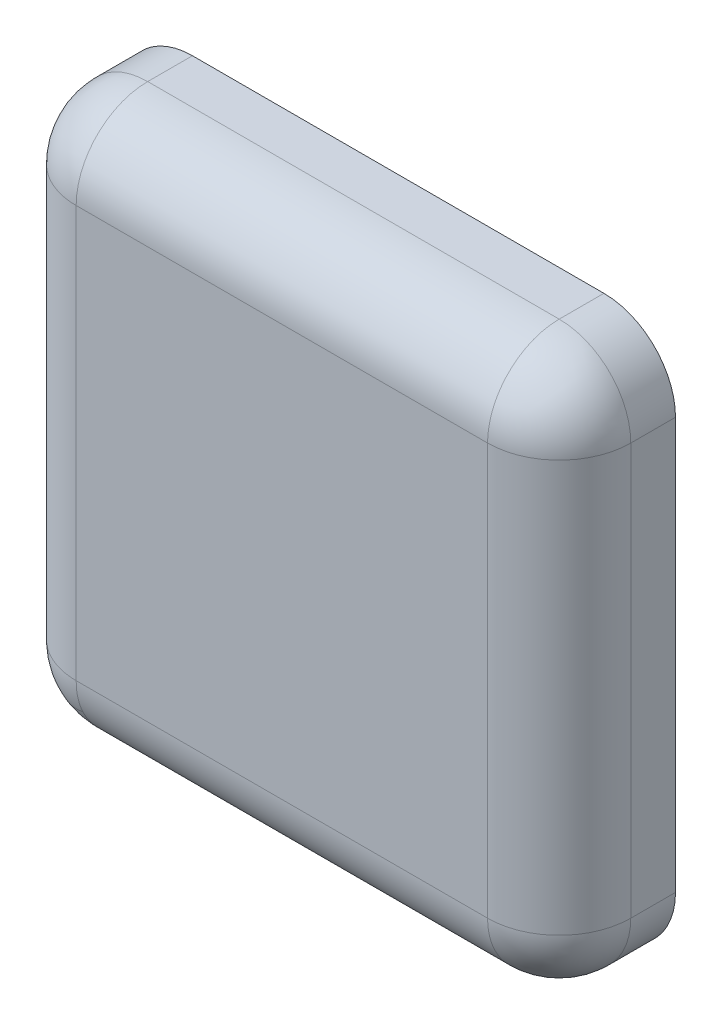
ISO-10303-21;
HEADER;
FILE_DESCRIPTION(('STEP AP214'),'2;1');
FILE_NAME('part.step','',(''),(''),'','','');
FILE_SCHEMA(('AUTOMOTIVE_DESIGN { 1 0 10303 214 1 1 1 1 }'));
ENDSEC;
DATA;
#1=APPLICATION_CONTEXT('core data for automotive mechanical design processes');
#2=APPLICATION_PROTOCOL_DEFINITION('international standard','automotive_design',2000,#1);
#3=PRODUCT_CONTEXT('',#1,'mechanical');
#4=PRODUCT('Part','Part','',(#3));
#5=PRODUCT_RELATED_PRODUCT_CATEGORY('part','',(#4));
#6=PRODUCT_DEFINITION_FORMATION('','',#4);
#7=PRODUCT_DEFINITION_CONTEXT('part definition',#1,'design');
#8=PRODUCT_DEFINITION('design','',#6,#7);
#9=PRODUCT_DEFINITION_SHAPE('','',#8);
#10=(LENGTH_UNIT() NAMED_UNIT(*) SI_UNIT(.MILLI.,.METRE.));
#11=(NAMED_UNIT(*) PLANE_ANGLE_UNIT() SI_UNIT($,.RADIAN.));
#12=(NAMED_UNIT(*) SI_UNIT($,.STERADIAN.) SOLID_ANGLE_UNIT());
#13=UNCERTAINTY_MEASURE_WITH_UNIT(LENGTH_MEASURE(1.E-05),#10,'distance_accuracy_value','');
#14=(GEOMETRIC_REPRESENTATION_CONTEXT(3) GLOBAL_UNCERTAINTY_ASSIGNED_CONTEXT((#13)) GLOBAL_UNIT_ASSIGNED_CONTEXT((#10,
#11,#12)) REPRESENTATION_CONTEXT('',''));
#15=CARTESIAN_POINT('',(0.,0.,0.));
#16=DIRECTION('',(0.,0.,1.));
#17=DIRECTION('',(1.,0.,0.));
#18=AXIS2_PLACEMENT_3D('',#15,#16,#17);
#19=CARTESIAN_POINT('',(-7.75,5.75,-3.25));
#20=DIRECTION('',(1.,0.,0.));
#21=DIRECTION('',(0.,0.,-1.));
#22=AXIS2_PLACEMENT_3D('',#19,#20,#21);
#23=PLANE('',#22);
#24=DIRECTION('',(0.,0.,1.));
#25=VECTOR('',#24,1.);
#26=CARTESIAN_POINT('',(-7.75,-5.75,-3.25));
#27=LINE('',#26,#25);
#28=CARTESIAN_POINT('',(-7.75,-5.75,-3.25));
#29=VERTEX_POINT('',#28);
#30=CARTESIAN_POINT('',(-7.75,-5.75,-2.));
#31=VERTEX_POINT('',#30);
#32=EDGE_CURVE('E11',#29,#31,#27,.T.);
#33=ORIENTED_EDGE('',*,*,#32,.T.);
#34=DIRECTION('',(0.,-1.,0.));
#35=VECTOR('',#34,1.);
#36=CARTESIAN_POINT('',(-7.75,5.75,-2.));
#37=LINE('',#36,#35);
#38=CARTESIAN_POINT('',(-7.75,5.75,-2.));
#39=VERTEX_POINT('',#38);
#40=EDGE_CURVE('E24',#39,#31,#37,.T.);
#41=ORIENTED_EDGE('',*,*,#40,.F.);
#42=DIRECTION('',(0.,0.,1.));
#43=VECTOR('',#42,1.);
#44=CARTESIAN_POINT('',(-7.75,5.75,-3.25));
#45=LINE('',#44,#43);
#46=CARTESIAN_POINT('',(-7.75,5.75,-3.25));
#47=VERTEX_POINT('',#46);
#48=EDGE_CURVE('E342',#47,#39,#45,.T.);
#49=ORIENTED_EDGE('',*,*,#48,.F.);
#50=DIRECTION('',(0.,-1.,0.));
#51=VECTOR('',#50,1.);
#52=CARTESIAN_POINT('',(-7.75,5.75,-3.25));
#53=LINE('',#52,#51);
#54=EDGE_CURVE('E338',#47,#29,#53,.T.);
#55=ORIENTED_EDGE('',*,*,#54,.T.);
#56=EDGE_LOOP('',(#33,#41,#49,#55));
#57=FACE_BOUND('',#56,.T.);
#58=ADVANCED_FACE('F16',(#57),#23,.F.);
#59=CARTESIAN_POINT('',(7.75,5.75,-3.25));
#60=DIRECTION('',(0.,0.,1.));
#61=DIRECTION('',(1.,0.,0.));
#62=AXIS2_PLACEMENT_3D('',#59,#60,#61);
#63=PLANE('',#62);
#64=CARTESIAN_POINT('',(0.,0.,-3.25));
#65=DIRECTION('',(0.,0.,-1.));
#66=DIRECTION('',(1.,0.,0.));
#67=AXIS2_PLACEMENT_3D('',#64,#65,#66);
#68=CIRCLE('',#67,5.35);
#69=CARTESIAN_POINT('',(-5.35,0.,-3.25));
#70=VERTEX_POINT('',#69);
#71=CARTESIAN_POINT('',(5.35,0.,-3.25));
#72=VERTEX_POINT('',#71);
#73=EDGE_CURVE('E333',#70,#72,#68,.T.);
#74=ORIENTED_EDGE('',*,*,#73,.F.);
#75=CARTESIAN_POINT('',(0.,0.,-3.25));
#76=DIRECTION('',(0.,0.,-1.));
#77=DIRECTION('',(1.,0.,0.));
#78=AXIS2_PLACEMENT_3D('',#75,#76,#77);
#79=CIRCLE('',#78,5.35);
#80=EDGE_CURVE('E328',#72,#70,#79,.T.);
#81=ORIENTED_EDGE('',*,*,#80,.F.);
#82=EDGE_LOOP('',(#74,#81));
#83=FACE_BOUND('',#82,.T.);
#84=CARTESIAN_POINT('',(-5.75,-5.75,-3.25));
#85=DIRECTION('',(0.,0.,1.));
#86=DIRECTION('',(1.,0.,0.));
#87=AXIS2_PLACEMENT_3D('',#84,#85,#86);
#88=CIRCLE('',#87,2.);
#89=CARTESIAN_POINT('',(-5.75,-7.75,-3.25));
#90=VERTEX_POINT('',#89);
#91=EDGE_CURVE('E323',#29,#90,#88,.T.);
#92=ORIENTED_EDGE('',*,*,#91,.F.);
#93=ORIENTED_EDGE('',*,*,#54,.F.);
#94=CARTESIAN_POINT('',(-5.75,5.75,-3.25));
#95=DIRECTION('',(0.,0.,-1.));
#96=DIRECTION('',(-1.,0.,0.));
#97=AXIS2_PLACEMENT_3D('',#94,#95,#96);
#98=CIRCLE('',#97,2.);
#99=CARTESIAN_POINT('',(-5.75,7.75,-3.25));
#100=VERTEX_POINT('',#99);
#101=EDGE_CURVE('E319',#47,#100,#98,.T.);
#102=ORIENTED_EDGE('',*,*,#101,.T.);
#103=DIRECTION('',(-1.,0.,0.));
#104=VECTOR('',#103,1.);
#105=CARTESIAN_POINT('',(5.75,7.75,-3.25));
#106=LINE('',#105,#104);
#107=CARTESIAN_POINT('',(5.75,7.75,-3.25));
#108=VERTEX_POINT('',#107);
#109=EDGE_CURVE('E314',#108,#100,#106,.T.);
#110=ORIENTED_EDGE('',*,*,#109,.F.);
#111=CARTESIAN_POINT('',(5.75,5.75,-3.25));
#112=DIRECTION('',(0.,0.,-1.));
#113=DIRECTION('',(-1.,0.,0.));
#114=AXIS2_PLACEMENT_3D('',#111,#112,#113);
#115=CIRCLE('',#114,2.);
#116=CARTESIAN_POINT('',(7.75,5.75,-3.25));
#117=VERTEX_POINT('',#116);
#118=EDGE_CURVE('E310',#108,#117,#115,.T.);
#119=ORIENTED_EDGE('',*,*,#118,.T.);
#120=DIRECTION('',(0.,-1.,0.));
#121=VECTOR('',#120,1.);
#122=CARTESIAN_POINT('',(7.75,5.75,-3.25));
#123=LINE('',#122,#121);
#124=CARTESIAN_POINT('',(7.75,-5.75,-3.25));
#125=VERTEX_POINT('',#124);
#126=EDGE_CURVE('E306',#117,#125,#123,.T.);
#127=ORIENTED_EDGE('',*,*,#126,.T.);
#128=CARTESIAN_POINT('',(5.75,-5.75,-3.25));
#129=DIRECTION('',(0.,0.,1.));
#130=DIRECTION('',(1.,0.,0.));
#131=AXIS2_PLACEMENT_3D('',#128,#129,#130);
#132=CIRCLE('',#131,2.);
#133=CARTESIAN_POINT('',(5.75,-7.75,-3.25));
#134=VERTEX_POINT('',#133);
#135=EDGE_CURVE('E301',#134,#125,#132,.T.);
#136=ORIENTED_EDGE('',*,*,#135,.F.);
#137=DIRECTION('',(-1.,0.,0.));
#138=VECTOR('',#137,1.);
#139=CARTESIAN_POINT('',(5.75,-7.75,-3.25));
#140=LINE('',#139,#138);
#141=EDGE_CURVE('E297',#134,#90,#140,.T.);
#142=ORIENTED_EDGE('',*,*,#141,.T.);
#143=EDGE_LOOP('',(#92,#93,#102,#110,#119,#127,#136,#142));
#144=FACE_BOUND('',#143,.T.);
#145=ADVANCED_FACE('F366',(#83,#144),#63,.F.);
#146=CARTESIAN_POINT('',(5.75,-7.75,-2.));
#147=DIRECTION('',(0.,1.,0.));
#148=DIRECTION('',(0.,0.,1.));
#149=AXIS2_PLACEMENT_3D('',#146,#147,#148);
#150=PLANE('',#149);
#151=DIRECTION('',(0.,0.,-1.));
#152=VECTOR('',#151,1.);
#153=CARTESIAN_POINT('',(-5.75,-7.75,-2.));
#154=LINE('',#153,#152);
#155=CARTESIAN_POINT('',(-5.75,-7.75,-2.));
#156=VERTEX_POINT('',#155);
#157=EDGE_CURVE('E292',#156,#90,#154,.T.);
#158=ORIENTED_EDGE('',*,*,#157,.T.);
#159=ORIENTED_EDGE('',*,*,#141,.F.);
#160=DIRECTION('',(0.,0.,-1.));
#161=VECTOR('',#160,1.);
#162=CARTESIAN_POINT('',(5.75,-7.75,-2.));
#163=LINE('',#162,#161);
#164=CARTESIAN_POINT('',(5.75,-7.75,-2.));
#165=VERTEX_POINT('',#164);
#166=EDGE_CURVE('E287',#165,#134,#163,.T.);
#167=ORIENTED_EDGE('',*,*,#166,.F.);
#168=DIRECTION('',(-1.,0.,0.));
#169=VECTOR('',#168,1.);
#170=CARTESIAN_POINT('',(5.75,-7.75,-2.));
#171=LINE('',#170,#169);
#172=EDGE_CURVE('E283',#165,#156,#171,.T.);
#173=ORIENTED_EDGE('',*,*,#172,.T.);
#174=EDGE_LOOP('',(#158,#159,#167,#173));
#175=FACE_BOUND('',#174,.T.);
#176=ADVANCED_FACE('F409',(#175),#150,.F.);
#177=CARTESIAN_POINT('',(5.75,-5.75,-2.));
#178=DIRECTION('',(-1.,0.,0.));
#179=DIRECTION('',(0.,0.707106781186547,-0.707106781186548));
#180=AXIS2_PLACEMENT_3D('',#177,#178,#179);
#181=CYLINDRICAL_SURFACE('',#180,2.);
#182=CARTESIAN_POINT('',(-5.75,-5.75,-2.));
#183=DIRECTION('',(1.,0.,0.));
#184=DIRECTION('',(0.,0.,-1.));
#185=AXIS2_PLACEMENT_3D('',#182,#183,#184);
#186=CIRCLE('',#185,2.);
#187=CARTESIAN_POINT('',(-5.75,-5.75,0.));
#188=VERTEX_POINT('',#187);
#189=CARTESIAN_POINT('',(-5.75,-6.60548603014267,-0.192199222195451));
#190=VERTEX_POINT('',#189);
#191=EDGE_CURVE('E279',#188,#190,#186,.T.);
#192=ORIENTED_EDGE('',*,*,#191,.T.);
#193=CARTESIAN_POINT('',(-5.75,-5.75,-2.));
#194=DIRECTION('',(1.,0.,0.));
#195=DIRECTION('',(0.,0.,-1.));
#196=AXIS2_PLACEMENT_3D('',#193,#194,#195);
#197=CIRCLE('',#196,2.);
#198=EDGE_CURVE('E274',#190,#156,#197,.T.);
#199=ORIENTED_EDGE('',*,*,#198,.T.);
#200=ORIENTED_EDGE('',*,*,#172,.F.);
#201=CARTESIAN_POINT('',(5.75,-5.75,-2.));
#202=DIRECTION('',(1.,0.,0.));
#203=DIRECTION('',(0.,0.,-1.));
#204=AXIS2_PLACEMENT_3D('',#201,#202,#203);
#205=CIRCLE('',#204,2.);
#206=CARTESIAN_POINT('',(5.75,-5.75,0.));
#207=VERTEX_POINT('',#206);
#208=EDGE_CURVE('E269',#207,#165,#205,.T.);
#209=ORIENTED_EDGE('',*,*,#208,.F.);
#210=DIRECTION('',(1.,0.,0.));
#211=VECTOR('',#210,1.);
#212=CARTESIAN_POINT('',(-5.75,-5.75,0.));
#213=LINE('',#212,#211);
#214=EDGE_CURVE('E264',#188,#207,#213,.T.);
#215=ORIENTED_EDGE('',*,*,#214,.F.);
#216=EDGE_LOOP('',(#192,#199,#200,#209,#215));
#217=FACE_BOUND('',#216,.T.);
#218=ADVANCED_FACE('F377',(#217),#181,.T.);
#219=CARTESIAN_POINT('',(-5.75,5.75,0.));
#220=DIRECTION('',(0.,0.,-1.));
#221=DIRECTION('',(-1.,0.,0.));
#222=AXIS2_PLACEMENT_3D('',#219,#220,#221);
#223=PLANE('',#222);
#224=ORIENTED_EDGE('',*,*,#214,.T.);
#225=DIRECTION('',(0.,-1.,0.));
#226=VECTOR('',#225,1.);
#227=CARTESIAN_POINT('',(5.75,5.75,0.));
#228=LINE('',#227,#226);
#229=CARTESIAN_POINT('',(5.75,5.75,0.));
#230=VERTEX_POINT('',#229);
#231=EDGE_CURVE('E259',#230,#207,#228,.T.);
#232=ORIENTED_EDGE('',*,*,#231,.F.);
#233=DIRECTION('',(1.,0.,0.));
#234=VECTOR('',#233,1.);
#235=CARTESIAN_POINT('',(-5.75,5.75,0.));
#236=LINE('',#235,#234);
#237=CARTESIAN_POINT('',(-5.75,5.75,0.));
#238=VERTEX_POINT('',#237);
#239=EDGE_CURVE('E254',#238,#230,#236,.T.);
#240=ORIENTED_EDGE('',*,*,#239,.F.);
#241=DIRECTION('',(0.,-1.,0.));
#242=VECTOR('',#241,1.);
#243=CARTESIAN_POINT('',(-5.75,5.75,0.));
#244=LINE('',#243,#242);
#245=EDGE_CURVE('E249',#238,#188,#244,.T.);
#246=ORIENTED_EDGE('',*,*,#245,.T.);
#247=EDGE_LOOP('',(#224,#232,#240,#246));
#248=FACE_BOUND('',#247,.T.);
#249=ADVANCED_FACE('F381',(#248),#223,.F.);
#250=CARTESIAN_POINT('',(-5.75,5.75,-2.));
#251=DIRECTION('',(0.,-1.,0.));
#252=DIRECTION('',(0.707106781186548,0.,-0.707106781186548));
#253=AXIS2_PLACEMENT_3D('',#250,#251,#252);
#254=CYLINDRICAL_SURFACE('',#253,2.);
#255=CARTESIAN_POINT('',(-5.75,-5.75,-2.));
#256=DIRECTION('',(0.,1.,0.));
#257=DIRECTION('',(1.,0.,0.));
#258=AXIS2_PLACEMENT_3D('',#255,#256,#257);
#259=CIRCLE('',#258,2.);
#260=EDGE_CURVE('E244',#31,#188,#259,.T.);
#261=ORIENTED_EDGE('',*,*,#260,.T.);
#262=ORIENTED_EDGE('',*,*,#245,.F.);
#263=CARTESIAN_POINT('',(-5.75,5.75,-2.));
#264=DIRECTION('',(0.,1.,0.));
#265=DIRECTION('',(1.,0.,0.));
#266=AXIS2_PLACEMENT_3D('',#263,#264,#265);
#267=CIRCLE('',#266,2.);
#268=EDGE_CURVE('E239',#39,#238,#267,.T.);
#269=ORIENTED_EDGE('',*,*,#268,.F.);
#270=ORIENTED_EDGE('',*,*,#40,.T.);
#271=EDGE_LOOP('',(#261,#262,#269,#270));
#272=FACE_BOUND('',#271,.T.);
#273=ADVANCED_FACE('F352',(#272),#254,.T.);
#274=CARTESIAN_POINT('',(-5.75,5.75,-2.));
#275=DIRECTION('',(-0.0561284970724483,0.559016994374947,-0.827254248593737));
#276=DIRECTION('',(0.6924837263176,-0.575083762295683,-0.435597239579331));
#277=AXIS2_PLACEMENT_3D('',#274,#275,#276);
#278=SPHERICAL_SURFACE('',#277,2.);
#279=CARTESIAN_POINT('',(-5.75,5.75,-2.));
#280=DIRECTION('',(0.,0.,-1.));
#281=DIRECTION('',(-1.,0.,0.));
#282=AXIS2_PLACEMENT_3D('',#279,#280,#281);
#283=CIRCLE('',#282,2.);
#284=CARTESIAN_POINT('',(-5.75,7.75,-2.));
#285=VERTEX_POINT('',#284);
#286=EDGE_CURVE('E234',#39,#285,#283,.T.);
#287=ORIENTED_EDGE('',*,*,#286,.F.);
#288=ORIENTED_EDGE('',*,*,#268,.T.);
#289=CARTESIAN_POINT('',(-5.75,5.75,-2.));
#290=DIRECTION('',(1.,0.,0.));
#291=DIRECTION('',(0.,0.,-1.));
#292=AXIS2_PLACEMENT_3D('',#289,#290,#291);
#293=CIRCLE('',#292,2.);
#294=EDGE_CURVE('E229',#285,#238,#293,.T.);
#295=ORIENTED_EDGE('',*,*,#294,.F.);
#296=EDGE_LOOP('',(#287,#288,#295));
#297=FACE_BOUND('',#296,.T.);
#298=ADVANCED_FACE('F358',(#297),#278,.T.);
#299=CARTESIAN_POINT('',(5.75,5.75,-2.));
#300=DIRECTION('',(-1.,0.,0.));
#301=DIRECTION('',(0.,-0.707106781186548,-0.707106781186547));
#302=AXIS2_PLACEMENT_3D('',#299,#300,#301);
#303=CYLINDRICAL_SURFACE('',#302,2.);
#304=ORIENTED_EDGE('',*,*,#294,.T.);
#305=ORIENTED_EDGE('',*,*,#239,.T.);
#306=CARTESIAN_POINT('',(5.75,5.75,-2.));
#307=DIRECTION('',(1.,0.,0.));
#308=DIRECTION('',(0.,0.,-1.));
#309=AXIS2_PLACEMENT_3D('',#306,#307,#308);
#310=CIRCLE('',#309,2.);
#311=CARTESIAN_POINT('',(5.75,7.75,-2.));
#312=VERTEX_POINT('',#311);
#313=EDGE_CURVE('E224',#312,#230,#310,.T.);
#314=ORIENTED_EDGE('',*,*,#313,.F.);
#315=DIRECTION('',(-1.,0.,0.));
#316=VECTOR('',#315,1.);
#317=CARTESIAN_POINT('',(5.75,7.75,-2.));
#318=LINE('',#317,#316);
#319=EDGE_CURVE('E219',#312,#285,#318,.T.);
#320=ORIENTED_EDGE('',*,*,#319,.T.);
#321=EDGE_LOOP('',(#304,#305,#314,#320));
#322=FACE_BOUND('',#321,.T.);
#323=ADVANCED_FACE('F384',(#322),#303,.T.);
#324=CARTESIAN_POINT('',(5.75,7.75,-3.25));
#325=DIRECTION('',(0.,-1.,0.));
#326=DIRECTION('',(0.,0.,-1.));
#327=AXIS2_PLACEMENT_3D('',#324,#325,#326);
#328=PLANE('',#327);
#329=DIRECTION('',(0.,0.,1.));
#330=VECTOR('',#329,1.);
#331=CARTESIAN_POINT('',(-5.75,7.75,-3.25));
#332=LINE('',#331,#330);
#333=EDGE_CURVE('E214',#100,#285,#332,.T.);
#334=ORIENTED_EDGE('',*,*,#333,.T.);
#335=ORIENTED_EDGE('',*,*,#319,.F.);
#336=DIRECTION('',(0.,0.,1.));
#337=VECTOR('',#336,1.);
#338=CARTESIAN_POINT('',(5.75,7.75,-3.25));
#339=LINE('',#338,#337);
#340=EDGE_CURVE('E209',#108,#312,#339,.T.);
#341=ORIENTED_EDGE('',*,*,#340,.F.);
#342=ORIENTED_EDGE('',*,*,#109,.T.);
#343=EDGE_LOOP('',(#334,#335,#341,#342));
#344=FACE_BOUND('',#343,.T.);
#345=ADVANCED_FACE('F389',(#344),#328,.F.);
#346=CARTESIAN_POINT('',(5.75,5.75,-3.25));
#347=DIRECTION('',(0.,0.,-1.));
#348=DIRECTION('',(-0.707106781186548,-0.707106781186548,0.));
#349=AXIS2_PLACEMENT_3D('',#346,#347,#348);
#350=CYLINDRICAL_SURFACE('',#349,2.);
#351=ORIENTED_EDGE('',*,*,#118,.F.);
#352=ORIENTED_EDGE('',*,*,#340,.T.);
#353=CARTESIAN_POINT('',(5.75,5.75,-2.));
#354=DIRECTION('',(0.,0.,-1.));
#355=DIRECTION('',(-1.,0.,0.));
#356=AXIS2_PLACEMENT_3D('',#353,#354,#355);
#357=CIRCLE('',#356,2.);
#358=CARTESIAN_POINT('',(7.75,5.75,-2.));
#359=VERTEX_POINT('',#358);
#360=EDGE_CURVE('E205',#312,#359,#357,.T.);
#361=ORIENTED_EDGE('',*,*,#360,.T.);
#362=DIRECTION('',(0.,0.,-1.));
#363=VECTOR('',#362,1.);
#364=CARTESIAN_POINT('',(7.75,5.75,-2.));
#365=LINE('',#364,#363);
#366=EDGE_CURVE('E200',#359,#117,#365,.T.);
#367=ORIENTED_EDGE('',*,*,#366,.T.);
#368=EDGE_LOOP('',(#351,#352,#361,#367));
#369=FACE_BOUND('',#368,.T.);
#370=ADVANCED_FACE('F397',(#369),#350,.T.);
#371=CARTESIAN_POINT('',(7.75,5.75,-2.));
#372=DIRECTION('',(-1.,0.,0.));
#373=DIRECTION('',(0.,0.,1.));
#374=AXIS2_PLACEMENT_3D('',#371,#372,#373);
#375=PLANE('',#374);
#376=DIRECTION('',(0.,0.,-1.));
#377=VECTOR('',#376,1.);
#378=CARTESIAN_POINT('',(7.75,-5.75,-2.));
#379=LINE('',#378,#377);
#380=CARTESIAN_POINT('',(7.75,-5.75,-2.));
#381=VERTEX_POINT('',#380);
#382=EDGE_CURVE('E195',#381,#125,#379,.T.);
#383=ORIENTED_EDGE('',*,*,#382,.T.);
#384=ORIENTED_EDGE('',*,*,#126,.F.);
#385=ORIENTED_EDGE('',*,*,#366,.F.);
#386=DIRECTION('',(0.,-1.,0.));
#387=VECTOR('',#386,1.);
#388=CARTESIAN_POINT('',(7.75,5.75,-2.));
#389=LINE('',#388,#387);
#390=EDGE_CURVE('E191',#359,#381,#389,.T.);
#391=ORIENTED_EDGE('',*,*,#390,.T.);
#392=EDGE_LOOP('',(#383,#384,#385,#391));
#393=FACE_BOUND('',#392,.T.);
#394=ADVANCED_FACE('F395',(#393),#375,.F.);
#395=CARTESIAN_POINT('',(5.75,5.75,-2.));
#396=DIRECTION('',(0.,-1.,0.));
#397=DIRECTION('',(-0.707106781186548,0.,-0.707106781186548));
#398=AXIS2_PLACEMENT_3D('',#395,#396,#397);
#399=CYLINDRICAL_SURFACE('',#398,2.);
#400=CARTESIAN_POINT('',(5.75,-5.75,-2.));
#401=DIRECTION('',(0.,1.,0.));
#402=DIRECTION('',(1.,0.,0.));
#403=AXIS2_PLACEMENT_3D('',#400,#401,#402);
#404=CIRCLE('',#403,2.);
#405=EDGE_CURVE('E186',#207,#381,#404,.T.);
#406=ORIENTED_EDGE('',*,*,#405,.T.);
#407=ORIENTED_EDGE('',*,*,#390,.F.);
#408=CARTESIAN_POINT('',(5.75,5.75,-2.));
#409=DIRECTION('',(0.,1.,0.));
#410=DIRECTION('',(1.,0.,0.));
#411=AXIS2_PLACEMENT_3D('',#408,#409,#410);
#412=CIRCLE('',#411,2.);
#413=EDGE_CURVE('E181',#230,#359,#412,.T.);
#414=ORIENTED_EDGE('',*,*,#413,.F.);
#415=ORIENTED_EDGE('',*,*,#231,.T.);
#416=EDGE_LOOP('',(#406,#407,#414,#415));
#417=FACE_BOUND('',#416,.T.);
#418=ADVANCED_FACE('F402',(#417),#399,.T.);
#419=CARTESIAN_POINT('',(5.75,5.75,-2.));
#420=DIRECTION('',(0.559016994374947,0.0561284970724482,-0.827254248593737));
#421=DIRECTION('',(-0.575083762295683,-0.6924837263176,-0.435597239579331));
#422=AXIS2_PLACEMENT_3D('',#419,#420,#421);
#423=SPHERICAL_SURFACE('',#422,2.);
#424=ORIENTED_EDGE('',*,*,#360,.F.);
#425=ORIENTED_EDGE('',*,*,#313,.T.);
#426=ORIENTED_EDGE('',*,*,#413,.T.);
#427=EDGE_LOOP('',(#424,#425,#426));
#428=FACE_BOUND('',#427,.T.);
#429=ADVANCED_FACE('F400',(#428),#423,.T.);
#430=CARTESIAN_POINT('',(5.75,-5.75,-2.));
#431=DIRECTION('',(-0.559016994374947,0.0561284970724482,0.827254248593737));
#432=DIRECTION('',(-0.575083762295683,0.692483726317601,-0.43559723957933));
#433=AXIS2_PLACEMENT_3D('',#430,#431,#432);
#434=SPHERICAL_SURFACE('',#433,2.);
#435=ORIENTED_EDGE('',*,*,#208,.T.);
#436=CARTESIAN_POINT('',(5.75,-5.75,-2.));
#437=DIRECTION('',(0.,0.,1.));
#438=DIRECTION('',(1.,0.,0.));
#439=AXIS2_PLACEMENT_3D('',#436,#437,#438);
#440=CIRCLE('',#439,2.);
#441=EDGE_CURVE('E176',#165,#381,#440,.T.);
#442=ORIENTED_EDGE('',*,*,#441,.T.);
#443=ORIENTED_EDGE('',*,*,#405,.F.);
#444=EDGE_LOOP('',(#435,#442,#443));
#445=FACE_BOUND('',#444,.T.);
#446=ADVANCED_FACE('F405',(#445),#434,.T.);
#447=CARTESIAN_POINT('',(5.75,-5.75,0.));
#448=DIRECTION('',(0.,0.,1.));
#449=DIRECTION('',(-0.707106781186548,0.707106781186547,0.));
#450=AXIS2_PLACEMENT_3D('',#447,#448,#449);
#451=CYLINDRICAL_SURFACE('',#450,2.);
#452=ORIENTED_EDGE('',*,*,#441,.F.);
#453=ORIENTED_EDGE('',*,*,#166,.T.);
#454=ORIENTED_EDGE('',*,*,#135,.T.);
#455=ORIENTED_EDGE('',*,*,#382,.F.);
#456=EDGE_LOOP('',(#452,#453,#454,#455));
#457=FACE_BOUND('',#456,.T.);
#458=ADVANCED_FACE('F407',(#457),#451,.T.);
#459=CARTESIAN_POINT('',(-5.75,5.75,-3.25));
#460=DIRECTION('',(0.,0.,-1.));
#461=DIRECTION('',(0.707106781186547,-0.707106781186548,0.));
#462=AXIS2_PLACEMENT_3D('',#459,#460,#461);
#463=CYLINDRICAL_SURFACE('',#462,2.);
#464=ORIENTED_EDGE('',*,*,#101,.F.);
#465=ORIENTED_EDGE('',*,*,#48,.T.);
#466=ORIENTED_EDGE('',*,*,#286,.T.);
#467=ORIENTED_EDGE('',*,*,#333,.F.);
#468=EDGE_LOOP('',(#464,#465,#466,#467));
#469=FACE_BOUND('',#468,.T.);
#470=ADVANCED_FACE('F362',(#469),#463,.T.);
#471=CARTESIAN_POINT('',(-5.75,-5.75,-2.));
#472=DIRECTION('',(-0.518577680705224,-0.512584456704584,0.684349591816388));
#473=DIRECTION('',(0.3125,-0.85863103232596,-0.406320686560328));
#474=AXIS2_PLACEMENT_3D('',#471,#472,#473);
#475=SPHERICAL_SURFACE('',#474,2.);
#476=CARTESIAN_POINT('',(-5.75,-5.75,-2.));
#477=DIRECTION('',(-0.3125,0.85863103232596,0.406320686560328));
#478=DIRECTION('',(-0.518577680705224,-0.512584456704584,0.684349591816388));
#479=AXIS2_PLACEMENT_3D('',#476,#477,#478);
#480=CIRCLE('',#479,2.);
#481=CARTESIAN_POINT('',(-6.78715536141045,-6.77516891340917,-0.631300816367224));
#482=VERTEX_POINT('',#481);
#483=EDGE_CURVE('E171',#482,#190,#480,.T.);
#484=ORIENTED_EDGE('',*,*,#483,.T.);
#485=ORIENTED_EDGE('',*,*,#191,.F.);
#486=ORIENTED_EDGE('',*,*,#260,.F.);
#487=CARTESIAN_POINT('',(-5.75,-5.75,-2.));
#488=DIRECTION('',(0.,0.,1.));
#489=DIRECTION('',(1.,0.,0.));
#490=AXIS2_PLACEMENT_3D('',#487,#488,#489);
#491=CIRCLE('',#490,2.);
#492=CARTESIAN_POINT('',(-7.6293965939992,-6.43400909530811,-2.));
#493=VERTEX_POINT('',#492);
#494=EDGE_CURVE('E167',#31,#493,#491,.T.);
#495=ORIENTED_EDGE('',*,*,#494,.T.);
#496=CARTESIAN_POINT('',(-5.75,-5.75,-2.));
#497=DIRECTION('',(0.3125,-0.85863103232596,-0.406320686560328));
#498=DIRECTION('',(-0.518577680705224,-0.512584456704584,0.684349591816388));
#499=AXIS2_PLACEMENT_3D('',#496,#497,#498);
#500=CIRCLE('',#499,2.);
#501=EDGE_CURVE('E162',#482,#493,#500,.T.);
#502=ORIENTED_EDGE('',*,*,#501,.F.);
#503=EDGE_LOOP('',(#484,#485,#486,#495,#502));
#504=FACE_BOUND('',#503,.T.);
#505=ADVANCED_FACE('F373',(#504),#475,.T.);
#506=CARTESIAN_POINT('',(-5.75,-5.75,-2.));
#507=DIRECTION('',(-0.518577680705224,-0.512584456704584,0.684349591816388));
#508=DIRECTION('',(-0.3125,0.85863103232596,0.406320686560328));
#509=AXIS2_PLACEMENT_3D('',#506,#507,#508);
#510=SPHERICAL_SURFACE('',#509,2.);
#511=ORIENTED_EDGE('',*,*,#501,.T.);
#512=CARTESIAN_POINT('',(-5.75,-5.75,-2.));
#513=DIRECTION('',(0.,0.,1.));
#514=DIRECTION('',(1.,0.,0.));
#515=AXIS2_PLACEMENT_3D('',#512,#513,#514);
#516=CIRCLE('',#515,2.);
#517=EDGE_CURVE('E157',#493,#156,#516,.T.);
#518=ORIENTED_EDGE('',*,*,#517,.T.);
#519=ORIENTED_EDGE('',*,*,#198,.F.);
#520=ORIENTED_EDGE('',*,*,#483,.F.);
#521=EDGE_LOOP('',(#511,#518,#519,#520));
#522=FACE_BOUND('',#521,.T.);
#523=ADVANCED_FACE('F546',(#522),#510,.T.);
#524=CARTESIAN_POINT('',(-5.75,-5.75,0.));
#525=DIRECTION('',(0.,0.,1.));
#526=DIRECTION('',(0.707106781186548,0.707106781186548,0.));
#527=AXIS2_PLACEMENT_3D('',#524,#525,#526);
#528=CYLINDRICAL_SURFACE('',#527,2.);
#529=ORIENTED_EDGE('',*,*,#517,.F.);
#530=ORIENTED_EDGE('',*,*,#494,.F.);
#531=ORIENTED_EDGE('',*,*,#32,.F.);
#532=ORIENTED_EDGE('',*,*,#91,.T.);
#533=ORIENTED_EDGE('',*,*,#157,.F.);
#534=EDGE_LOOP('',(#529,#530,#531,#532,#533));
#535=FACE_BOUND('',#534,.T.);
#536=ADVANCED_FACE('F371',(#535),#528,.T.);
#537=CARTESIAN_POINT('',(0.,0.,0.));
#538=DIRECTION('',(0.,0.,1.));
#539=DIRECTION('',(0.,1.,0.));
#540=AXIS2_PLACEMENT_3D('',#537,#538,#539);
#541=CYLINDRICAL_SURFACE('',#540,5.35);
#542=DIRECTION('',(0.,0.,1.));
#543=VECTOR('',#542,1.);
#544=CARTESIAN_POINT('',(-5.35,0.,-5.2200583678069));
#545=LINE('',#544,#543);
#546=CARTESIAN_POINT('',(-5.35,0.,-5.2200583678069));
#547=VERTEX_POINT('',#546);
#548=EDGE_CURVE('E152',#547,#70,#545,.T.);
#549=ORIENTED_EDGE('',*,*,#548,.F.);
#550=CARTESIAN_POINT('',(0.,0.,-5.2200583678069));
#551=DIRECTION('',(0.,0.,1.));
#552=DIRECTION('',(1.,0.,0.));
#553=AXIS2_PLACEMENT_3D('',#550,#551,#552);
#554=CIRCLE('',#553,5.35);
#555=CARTESIAN_POINT('',(5.35,0.,-5.2200583678069));
#556=VERTEX_POINT('',#555);
#557=EDGE_CURVE('E133',#547,#556,#554,.T.);
#558=ORIENTED_EDGE('',*,*,#557,.T.);
#559=DIRECTION('',(0.,0.,1.));
#560=VECTOR('',#559,1.);
#561=CARTESIAN_POINT('',(5.35,0.,-5.2200583678069));
#562=LINE('',#561,#560);
#563=EDGE_CURVE('E137',#556,#72,#562,.T.);
#564=ORIENTED_EDGE('',*,*,#563,.T.);
#565=ORIENTED_EDGE('',*,*,#80,.T.);
#566=EDGE_LOOP('',(#549,#558,#564,#565));
#567=FACE_BOUND('',#566,.T.);
#568=ADVANCED_FACE('F564',(#567),#541,.T.);
#569=CARTESIAN_POINT('',(0.,0.,0.));
#570=DIRECTION('',(0.,0.,1.));
#571=DIRECTION('',(0.,-1.,0.));
#572=AXIS2_PLACEMENT_3D('',#569,#570,#571);
#573=CYLINDRICAL_SURFACE('',#572,5.35);
#574=ORIENTED_EDGE('',*,*,#548,.T.);
#575=ORIENTED_EDGE('',*,*,#73,.T.);
#576=ORIENTED_EDGE('',*,*,#563,.F.);
#577=CARTESIAN_POINT('',(0.,0.,-5.2200583678069));
#578=DIRECTION('',(0.,0.,1.));
#579=DIRECTION('',(1.,0.,0.));
#580=AXIS2_PLACEMENT_3D('',#577,#578,#579);
#581=CIRCLE('',#580,5.35);
#582=EDGE_CURVE('E134',#556,#547,#581,.T.);
#583=ORIENTED_EDGE('',*,*,#582,.T.);
#584=EDGE_LOOP('',(#574,#575,#576,#583));
#585=FACE_BOUND('',#584,.T.);
#586=ADVANCED_FACE('F573',(#585),#573,.T.);
#587=CARTESIAN_POINT('',(0.,0.,-6.5));
#588=DIRECTION('',(0.,0.,1.));
#589=DIRECTION('',(0.,-1.,0.));
#590=AXIS2_PLACEMENT_3D('',#587,#588,#589);
#591=CONICAL_SURFACE('',#590,4.35,0.663225115757837);
#592=DIRECTION('',(-0.615661475325652,0.,0.788010753606727));
#593=VECTOR('',#592,1.);
#594=CARTESIAN_POINT('',(-4.35,0.,-6.5));
#595=LINE('',#594,#593);
#596=CARTESIAN_POINT('',(-4.35,0.,-6.5));
#597=VERTEX_POINT('',#596);
#598=EDGE_CURVE('E121',#597,#547,#595,.T.);
#599=ORIENTED_EDGE('',*,*,#598,.T.);
#600=ORIENTED_EDGE('',*,*,#582,.F.);
#601=DIRECTION('',(0.615661475325652,0.,0.788010753606727));
#602=VECTOR('',#601,1.);
#603=CARTESIAN_POINT('',(4.35,0.,-6.5));
#604=LINE('',#603,#602);
#605=CARTESIAN_POINT('',(4.35,0.,-6.5));
#606=VERTEX_POINT('',#605);
#607=EDGE_CURVE('E124',#606,#556,#604,.T.);
#608=ORIENTED_EDGE('',*,*,#607,.F.);
#609=CARTESIAN_POINT('',(0.,0.,-6.5));
#610=DIRECTION('',(0.,0.,1.));
#611=DIRECTION('',(1.,0.,0.));
#612=AXIS2_PLACEMENT_3D('',#609,#610,#611);
#613=CIRCLE('',#612,4.35);
#614=EDGE_CURVE('E116',#606,#597,#613,.T.);
#615=ORIENTED_EDGE('',*,*,#614,.T.);
#616=EDGE_LOOP('',(#599,#600,#608,#615));
#617=FACE_BOUND('',#616,.T.);
#618=ADVANCED_FACE('F118',(#617),#591,.T.);
#619=CARTESIAN_POINT('',(0.,0.,-6.5));
#620=DIRECTION('',(0.,0.,1.));
#621=DIRECTION('',(1.,0.,0.));
#622=AXIS2_PLACEMENT_3D('',#619,#620,#621);
#623=PLANE('',#622);
#624=CARTESIAN_POINT('',(0.,0.,-6.5));
#625=DIRECTION('',(0.,0.,1.));
#626=DIRECTION('',(1.,0.,0.));
#627=AXIS2_PLACEMENT_3D('',#624,#625,#626);
#628=CIRCLE('',#627,4.35);
#629=EDGE_CURVE('E127',#597,#606,#628,.T.);
#630=ORIENTED_EDGE('',*,*,#629,.F.);
#631=ORIENTED_EDGE('',*,*,#614,.F.);
#632=EDGE_LOOP('',(#630,#631));
#633=FACE_BOUND('',#632,.T.);
#634=ADVANCED_FACE('F129',(#633),#623,.F.);
#635=CARTESIAN_POINT('',(0.,0.,-6.5));
#636=DIRECTION('',(0.,0.,1.));
#637=DIRECTION('',(0.,1.,0.));
#638=AXIS2_PLACEMENT_3D('',#635,#636,#637);
#639=CONICAL_SURFACE('',#638,4.35,0.663225115757837);
#640=ORIENTED_EDGE('',*,*,#598,.F.);
#641=ORIENTED_EDGE('',*,*,#629,.T.);
#642=ORIENTED_EDGE('',*,*,#607,.T.);
#643=ORIENTED_EDGE('',*,*,#557,.F.);
#644=EDGE_LOOP('',(#640,#641,#642,#643));
#645=FACE_BOUND('',#644,.T.);
#646=ADVANCED_FACE('F132',(#645),#639,.T.);
#647=CLOSED_SHELL('',(#58,#145,#176,#218,#249,#273,#298,#323,#345,#370,#394,#418,#429,#446,#458,
#470,#505,#523,#536,#568,#586,#618,#634,#646));
#648=MANIFOLD_SOLID_BREP('B1',#647);
#649=ADVANCED_BREP_SHAPE_REPRESENTATION('',(#18,#648),#14);
#650=SHAPE_DEFINITION_REPRESENTATION(#9,#649);
ENDSEC;
END-ISO-10303-21;
